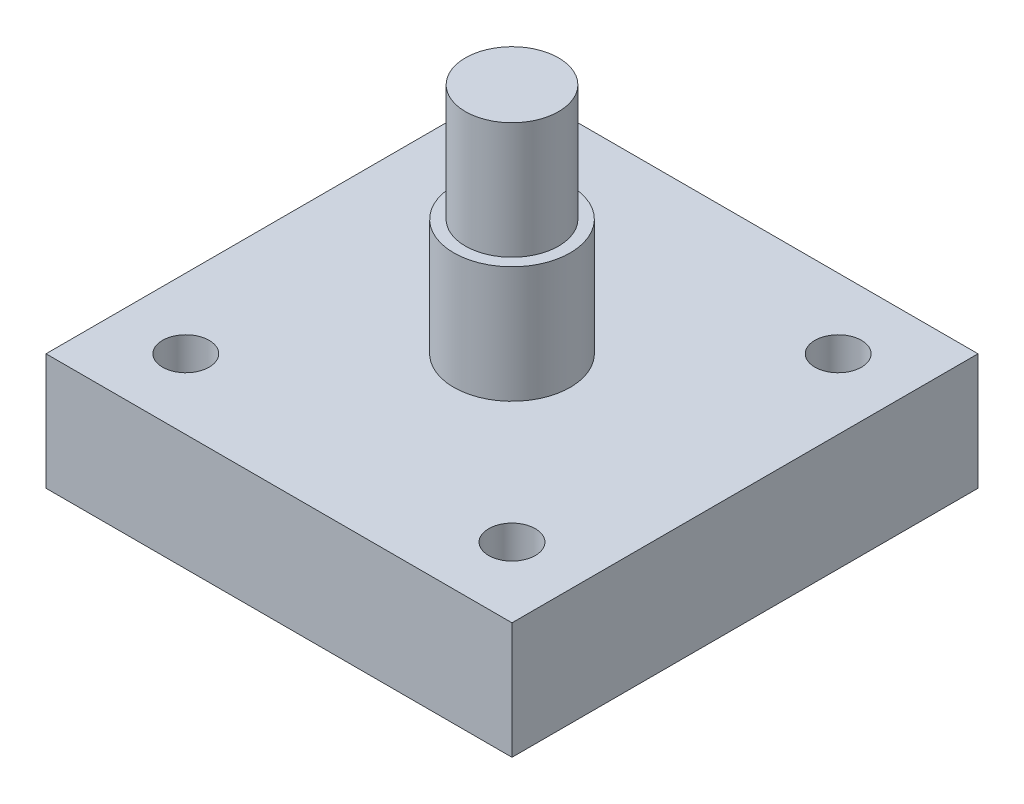
ISO-10303-21;
HEADER;
FILE_DESCRIPTION(('STEP AP214'),'2;1');
FILE_NAME('part.step','',(''),(''),'','','');
FILE_SCHEMA(('AUTOMOTIVE_DESIGN { 1 0 10303 214 1 1 1 1 }'));
ENDSEC;
DATA;
#1=APPLICATION_CONTEXT('core data for automotive mechanical design processes');
#2=APPLICATION_PROTOCOL_DEFINITION('international standard','automotive_design',2000,#1);
#3=PRODUCT_CONTEXT('',#1,'mechanical');
#4=PRODUCT('Part','Part','',(#3));
#5=PRODUCT_RELATED_PRODUCT_CATEGORY('part','',(#4));
#6=PRODUCT_DEFINITION_FORMATION('','',#4);
#7=PRODUCT_DEFINITION_CONTEXT('part definition',#1,'design');
#8=PRODUCT_DEFINITION('design','',#6,#7);
#9=PRODUCT_DEFINITION_SHAPE('','',#8);
#10=(LENGTH_UNIT() NAMED_UNIT(*) SI_UNIT(.MILLI.,.METRE.));
#11=(NAMED_UNIT(*) PLANE_ANGLE_UNIT() SI_UNIT($,.RADIAN.));
#12=(NAMED_UNIT(*) SI_UNIT($,.STERADIAN.) SOLID_ANGLE_UNIT());
#13=UNCERTAINTY_MEASURE_WITH_UNIT(LENGTH_MEASURE(1.E-05),#10,'distance_accuracy_value','');
#14=(GEOMETRIC_REPRESENTATION_CONTEXT(3) GLOBAL_UNCERTAINTY_ASSIGNED_CONTEXT((#13)) GLOBAL_UNIT_ASSIGNED_CONTEXT((#10,
#11,#12)) REPRESENTATION_CONTEXT('',''));
#15=CARTESIAN_POINT('',(0.,0.,0.));
#16=DIRECTION('',(0.,0.,1.));
#17=DIRECTION('',(1.,0.,0.));
#18=AXIS2_PLACEMENT_3D('',#15,#16,#17);
#19=CARTESIAN_POINT('',(0.,12.5,10.));
#20=DIRECTION('',(0.,-1.,0.));
#21=DIRECTION('',(0.,0.,-1.));
#22=AXIS2_PLACEMENT_3D('',#19,#20,#21);
#23=CYLINDRICAL_SURFACE('',#22,2.5);
#24=CARTESIAN_POINT('',(0.,2.5,10.));
#25=DIRECTION('',(0.,1.,0.));
#26=DIRECTION('',(0.,0.,1.));
#27=AXIS2_PLACEMENT_3D('',#24,#25,#26);
#28=CIRCLE('',#27,2.5);
#29=CARTESIAN_POINT('',(0.,2.5,12.5));
#30=VERTEX_POINT('',#29);
#31=EDGE_CURVE('E11',#30,#30,#28,.T.);
#32=ORIENTED_EDGE('',*,*,#31,.T.);
#33=EDGE_LOOP('',(#32));
#34=FACE_BOUND('',#33,.T.);
#35=CARTESIAN_POINT('',(0.,7.5,10.));
#36=DIRECTION('',(0.,1.,0.));
#37=DIRECTION('',(0.,0.,1.));
#38=AXIS2_PLACEMENT_3D('',#35,#36,#37);
#39=CIRCLE('',#38,2.5);
#40=CARTESIAN_POINT('',(0.,7.5,12.5));
#41=VERTEX_POINT('',#40);
#42=EDGE_CURVE('E140',#41,#41,#39,.T.);
#43=ORIENTED_EDGE('',*,*,#42,.F.);
#44=EDGE_LOOP('',(#43));
#45=FACE_BOUND('',#44,.T.);
#46=ADVANCED_FACE('F38',(#34,#45),#23,.T.);
#47=CARTESIAN_POINT('',(10.,2.5,20.));
#48=DIRECTION('',(-1.,0.,0.));
#49=DIRECTION('',(0.,0.,1.));
#50=AXIS2_PLACEMENT_3D('',#47,#48,#49);
#51=PLANE('',#50);
#52=DIRECTION('',(0.,1.,0.));
#53=VECTOR('',#52,1.);
#54=CARTESIAN_POINT('',(10.,2.5,0.));
#55=LINE('',#54,#53);
#56=CARTESIAN_POINT('',(10.,-2.5,0.));
#57=VERTEX_POINT('',#56);
#58=CARTESIAN_POINT('',(10.,2.5,0.));
#59=VERTEX_POINT('',#58);
#60=EDGE_CURVE('E105',#57,#59,#55,.T.);
#61=ORIENTED_EDGE('',*,*,#60,.T.);
#62=DIRECTION('',(0.,0.,-1.));
#63=VECTOR('',#62,1.);
#64=CARTESIAN_POINT('',(10.,2.5,20.));
#65=LINE('',#64,#63);
#66=CARTESIAN_POINT('',(10.,2.5,20.));
#67=VERTEX_POINT('',#66);
#68=EDGE_CURVE('E42',#67,#59,#65,.T.);
#69=ORIENTED_EDGE('',*,*,#68,.F.);
#70=DIRECTION('',(0.,1.,0.));
#71=VECTOR('',#70,1.);
#72=CARTESIAN_POINT('',(10.,2.5,20.));
#73=LINE('',#72,#71);
#74=CARTESIAN_POINT('',(10.,-2.5,20.));
#75=VERTEX_POINT('',#74);
#76=EDGE_CURVE('E92',#75,#67,#73,.T.);
#77=ORIENTED_EDGE('',*,*,#76,.F.);
#78=DIRECTION('',(0.,0.,-1.));
#79=VECTOR('',#78,1.);
#80=CARTESIAN_POINT('',(10.,-2.5,20.));
#81=LINE('',#80,#79);
#82=EDGE_CURVE('E101',#75,#57,#81,.T.);
#83=ORIENTED_EDGE('',*,*,#82,.T.);
#84=EDGE_LOOP('',(#61,#69,#77,#83));
#85=FACE_BOUND('',#84,.T.);
#86=ADVANCED_FACE('F40',(#85),#51,.F.);
#87=CARTESIAN_POINT('',(-10.,2.5,20.));
#88=DIRECTION('',(0.,-1.,0.));
#89=DIRECTION('',(0.,0.,-1.));
#90=AXIS2_PLACEMENT_3D('',#87,#88,#89);
#91=PLANE('',#90);
#92=CARTESIAN_POINT('',(7.,2.5,3.));
#93=DIRECTION('',(0.,1.,0.));
#94=DIRECTION('',(0.,0.,1.));
#95=AXIS2_PLACEMENT_3D('',#92,#93,#94);
#96=CIRCLE('',#95,1.);
#97=CARTESIAN_POINT('',(7.,2.5,4.));
#98=VERTEX_POINT('',#97);
#99=EDGE_CURVE('E132',#98,#98,#96,.T.);
#100=ORIENTED_EDGE('',*,*,#99,.F.);
#101=EDGE_LOOP('',(#100));
#102=FACE_BOUND('',#101,.T.);
#103=CARTESIAN_POINT('',(-7.,2.5,17.));
#104=DIRECTION('',(0.,1.,0.));
#105=DIRECTION('',(0.,0.,1.));
#106=AXIS2_PLACEMENT_3D('',#103,#104,#105);
#107=CIRCLE('',#106,1.);
#108=CARTESIAN_POINT('',(-7.,2.5,18.));
#109=VERTEX_POINT('',#108);
#110=EDGE_CURVE('E125',#109,#109,#107,.T.);
#111=ORIENTED_EDGE('',*,*,#110,.F.);
#112=EDGE_LOOP('',(#111));
#113=FACE_BOUND('',#112,.T.);
#114=CARTESIAN_POINT('',(7.,2.5,17.));
#115=DIRECTION('',(0.,1.,0.));
#116=DIRECTION('',(0.,0.,1.));
#117=AXIS2_PLACEMENT_3D('',#114,#115,#116);
#118=CIRCLE('',#117,1.);
#119=CARTESIAN_POINT('',(7.,2.5,18.));
#120=VERTEX_POINT('',#119);
#121=EDGE_CURVE('E137',#120,#120,#118,.T.);
#122=ORIENTED_EDGE('',*,*,#121,.F.);
#123=EDGE_LOOP('',(#122));
#124=FACE_BOUND('',#123,.T.);
#125=CARTESIAN_POINT('',(-7.,2.5,3.));
#126=DIRECTION('',(0.,1.,0.));
#127=DIRECTION('',(0.,0.,1.));
#128=AXIS2_PLACEMENT_3D('',#125,#126,#127);
#129=CIRCLE('',#128,1.);
#130=CARTESIAN_POINT('',(-7.,2.5,4.));
#131=VERTEX_POINT('',#130);
#132=EDGE_CURVE('E119',#131,#131,#129,.T.);
#133=ORIENTED_EDGE('',*,*,#132,.F.);
#134=EDGE_LOOP('',(#133));
#135=FACE_BOUND('',#134,.T.);
#136=ORIENTED_EDGE('',*,*,#31,.F.);
#137=EDGE_LOOP('',(#136));
#138=FACE_BOUND('',#137,.T.);
#139=DIRECTION('',(-1.,0.,0.));
#140=VECTOR('',#139,1.);
#141=CARTESIAN_POINT('',(-10.,2.5,0.));
#142=LINE('',#141,#140);
#143=CARTESIAN_POINT('',(-10.,2.5,0.));
#144=VERTEX_POINT('',#143);
#145=EDGE_CURVE('E97',#59,#144,#142,.T.);
#146=ORIENTED_EDGE('',*,*,#145,.T.);
#147=DIRECTION('',(0.,0.,-1.));
#148=VECTOR('',#147,1.);
#149=CARTESIAN_POINT('',(-10.,2.5,20.));
#150=LINE('',#149,#148);
#151=CARTESIAN_POINT('',(-10.,2.5,20.));
#152=VERTEX_POINT('',#151);
#153=EDGE_CURVE('E95',#152,#144,#150,.T.);
#154=ORIENTED_EDGE('',*,*,#153,.F.);
#155=DIRECTION('',(-1.,0.,0.));
#156=VECTOR('',#155,1.);
#157=CARTESIAN_POINT('',(-10.,2.5,20.));
#158=LINE('',#157,#156);
#159=EDGE_CURVE('E87',#67,#152,#158,.T.);
#160=ORIENTED_EDGE('',*,*,#159,.F.);
#161=ORIENTED_EDGE('',*,*,#68,.T.);
#162=EDGE_LOOP('',(#146,#154,#160,#161));
#163=FACE_BOUND('',#162,.T.);
#164=ADVANCED_FACE('F96',(#102,#113,#124,#135,#138,#163),#91,.F.);
#165=CARTESIAN_POINT('',(-10.,2.5,20.));
#166=DIRECTION('',(1.,0.,0.));
#167=DIRECTION('',(0.,0.,-1.));
#168=AXIS2_PLACEMENT_3D('',#165,#166,#167);
#169=PLANE('',#168);
#170=DIRECTION('',(0.,-1.,0.));
#171=VECTOR('',#170,1.);
#172=CARTESIAN_POINT('',(-10.,2.5,0.));
#173=LINE('',#172,#171);
#174=CARTESIAN_POINT('',(-10.,-2.5,0.));
#175=VERTEX_POINT('',#174);
#176=EDGE_CURVE('E73',#144,#175,#173,.T.);
#177=ORIENTED_EDGE('',*,*,#176,.T.);
#178=DIRECTION('',(0.,0.,-1.));
#179=VECTOR('',#178,1.);
#180=CARTESIAN_POINT('',(-10.,-2.5,20.));
#181=LINE('',#180,#179);
#182=CARTESIAN_POINT('',(-10.,-2.5,20.));
#183=VERTEX_POINT('',#182);
#184=EDGE_CURVE('E98',#183,#175,#181,.T.);
#185=ORIENTED_EDGE('',*,*,#184,.F.);
#186=DIRECTION('',(0.,-1.,0.));
#187=VECTOR('',#186,1.);
#188=CARTESIAN_POINT('',(-10.,2.5,20.));
#189=LINE('',#188,#187);
#190=EDGE_CURVE('E90',#152,#183,#189,.T.);
#191=ORIENTED_EDGE('',*,*,#190,.F.);
#192=ORIENTED_EDGE('',*,*,#153,.T.);
#193=EDGE_LOOP('',(#177,#185,#191,#192));
#194=FACE_BOUND('',#193,.T.);
#195=ADVANCED_FACE('F99',(#194),#169,.F.);
#196=CARTESIAN_POINT('',(-10.,-2.5,20.));
#197=DIRECTION('',(0.,1.,0.));
#198=DIRECTION('',(0.,0.,1.));
#199=AXIS2_PLACEMENT_3D('',#196,#197,#198);
#200=PLANE('',#199);
#201=CARTESIAN_POINT('',(7.,-2.5,3.));
#202=DIRECTION('',(0.,1.,0.));
#203=DIRECTION('',(0.,0.,1.));
#204=AXIS2_PLACEMENT_3D('',#201,#202,#203);
#205=CIRCLE('',#204,1.);
#206=CARTESIAN_POINT('',(7.,-2.5,4.));
#207=VERTEX_POINT('',#206);
#208=EDGE_CURVE('E122',#207,#207,#205,.T.);
#209=ORIENTED_EDGE('',*,*,#208,.T.);
#210=EDGE_LOOP('',(#209));
#211=FACE_BOUND('',#210,.T.);
#212=CARTESIAN_POINT('',(-7.,-2.5,17.));
#213=DIRECTION('',(0.,1.,0.));
#214=DIRECTION('',(0.,0.,1.));
#215=AXIS2_PLACEMENT_3D('',#212,#213,#214);
#216=CIRCLE('',#215,1.);
#217=CARTESIAN_POINT('',(-7.,-2.5,18.));
#218=VERTEX_POINT('',#217);
#219=EDGE_CURVE('E128',#218,#218,#216,.T.);
#220=ORIENTED_EDGE('',*,*,#219,.T.);
#221=EDGE_LOOP('',(#220));
#222=FACE_BOUND('',#221,.T.);
#223=CARTESIAN_POINT('',(7.,-2.5,17.));
#224=DIRECTION('',(0.,1.,0.));
#225=DIRECTION('',(0.,0.,1.));
#226=AXIS2_PLACEMENT_3D('',#223,#224,#225);
#227=CIRCLE('',#226,1.);
#228=CARTESIAN_POINT('',(7.,-2.5,18.));
#229=VERTEX_POINT('',#228);
#230=EDGE_CURVE('E129',#229,#229,#227,.T.);
#231=ORIENTED_EDGE('',*,*,#230,.T.);
#232=EDGE_LOOP('',(#231));
#233=FACE_BOUND('',#232,.T.);
#234=CARTESIAN_POINT('',(-7.,-2.5,3.));
#235=DIRECTION('',(0.,1.,0.));
#236=DIRECTION('',(0.,0.,1.));
#237=AXIS2_PLACEMENT_3D('',#234,#235,#236);
#238=CIRCLE('',#237,1.);
#239=CARTESIAN_POINT('',(-7.,-2.5,4.));
#240=VERTEX_POINT('',#239);
#241=EDGE_CURVE('E108',#240,#240,#238,.T.);
#242=ORIENTED_EDGE('',*,*,#241,.T.);
#243=EDGE_LOOP('',(#242));
#244=FACE_BOUND('',#243,.T.);
#245=DIRECTION('',(1.,0.,0.));
#246=VECTOR('',#245,1.);
#247=CARTESIAN_POINT('',(-10.,-2.5,0.));
#248=LINE('',#247,#246);
#249=EDGE_CURVE('E79',#175,#57,#248,.T.);
#250=ORIENTED_EDGE('',*,*,#249,.T.);
#251=ORIENTED_EDGE('',*,*,#82,.F.);
#252=DIRECTION('',(1.,0.,0.));
#253=VECTOR('',#252,1.);
#254=CARTESIAN_POINT('',(-10.,-2.5,20.));
#255=LINE('',#254,#253);
#256=EDGE_CURVE('E56',#183,#75,#255,.T.);
#257=ORIENTED_EDGE('',*,*,#256,.F.);
#258=ORIENTED_EDGE('',*,*,#184,.T.);
#259=EDGE_LOOP('',(#250,#251,#257,#258));
#260=FACE_BOUND('',#259,.T.);
#261=ADVANCED_FACE('F113',(#211,#222,#233,#244,#260),#200,.F.);
#262=CARTESIAN_POINT('',(0.,0.,20.));
#263=DIRECTION('',(0.,0.,1.));
#264=DIRECTION('',(1.,0.,0.));
#265=AXIS2_PLACEMENT_3D('',#262,#263,#264);
#266=PLANE('',#265);
#267=ORIENTED_EDGE('',*,*,#76,.T.);
#268=ORIENTED_EDGE('',*,*,#159,.T.);
#269=ORIENTED_EDGE('',*,*,#190,.T.);
#270=ORIENTED_EDGE('',*,*,#256,.T.);
#271=EDGE_LOOP('',(#267,#268,#269,#270));
#272=FACE_BOUND('',#271,.T.);
#273=ADVANCED_FACE('F88',(#272),#266,.T.);
#274=CARTESIAN_POINT('',(0.,0.,0.));
#275=DIRECTION('',(0.,0.,1.));
#276=DIRECTION('',(1.,0.,0.));
#277=AXIS2_PLACEMENT_3D('',#274,#275,#276);
#278=PLANE('',#277);
#279=ORIENTED_EDGE('',*,*,#60,.F.);
#280=ORIENTED_EDGE('',*,*,#249,.F.);
#281=ORIENTED_EDGE('',*,*,#176,.F.);
#282=ORIENTED_EDGE('',*,*,#145,.F.);
#283=EDGE_LOOP('',(#279,#280,#281,#282));
#284=FACE_BOUND('',#283,.T.);
#285=ADVANCED_FACE('F116',(#284),#278,.F.);
#286=CARTESIAN_POINT('',(-7.,-2.5,3.));
#287=DIRECTION('',(0.,1.,0.));
#288=DIRECTION('',(0.,0.,1.));
#289=AXIS2_PLACEMENT_3D('',#286,#287,#288);
#290=CYLINDRICAL_SURFACE('',#289,1.);
#291=ORIENTED_EDGE('',*,*,#241,.F.);
#292=EDGE_LOOP('',(#291));
#293=FACE_BOUND('',#292,.T.);
#294=ORIENTED_EDGE('',*,*,#132,.T.);
#295=EDGE_LOOP('',(#294));
#296=FACE_BOUND('',#295,.T.);
#297=ADVANCED_FACE('F176',(#293,#296),#290,.F.);
#298=CARTESIAN_POINT('',(7.,-2.5,17.));
#299=DIRECTION('',(0.,1.,0.));
#300=DIRECTION('',(0.,0.,1.));
#301=AXIS2_PLACEMENT_3D('',#298,#299,#300);
#302=CYLINDRICAL_SURFACE('',#301,1.);
#303=ORIENTED_EDGE('',*,*,#230,.F.);
#304=EDGE_LOOP('',(#303));
#305=FACE_BOUND('',#304,.T.);
#306=ORIENTED_EDGE('',*,*,#121,.T.);
#307=EDGE_LOOP('',(#306));
#308=FACE_BOUND('',#307,.T.);
#309=ADVANCED_FACE('F196',(#305,#308),#302,.F.);
#310=CARTESIAN_POINT('',(-7.,-2.5,17.));
#311=DIRECTION('',(0.,1.,0.));
#312=DIRECTION('',(0.,0.,1.));
#313=AXIS2_PLACEMENT_3D('',#310,#311,#312);
#314=CYLINDRICAL_SURFACE('',#313,1.);
#315=ORIENTED_EDGE('',*,*,#219,.F.);
#316=EDGE_LOOP('',(#315));
#317=FACE_BOUND('',#316,.T.);
#318=ORIENTED_EDGE('',*,*,#110,.T.);
#319=EDGE_LOOP('',(#318));
#320=FACE_BOUND('',#319,.T.);
#321=ADVANCED_FACE('F201',(#317,#320),#314,.F.);
#322=CARTESIAN_POINT('',(7.,-2.5,3.));
#323=DIRECTION('',(0.,1.,0.));
#324=DIRECTION('',(0.,0.,1.));
#325=AXIS2_PLACEMENT_3D('',#322,#323,#324);
#326=CYLINDRICAL_SURFACE('',#325,1.);
#327=ORIENTED_EDGE('',*,*,#208,.F.);
#328=EDGE_LOOP('',(#327));
#329=FACE_BOUND('',#328,.T.);
#330=ORIENTED_EDGE('',*,*,#99,.T.);
#331=EDGE_LOOP('',(#330));
#332=FACE_BOUND('',#331,.T.);
#333=ADVANCED_FACE('F158',(#329,#332),#326,.F.);
#334=CARTESIAN_POINT('',(0.,7.5,10.));
#335=DIRECTION('',(0.,1.,0.));
#336=DIRECTION('',(0.,0.,1.));
#337=AXIS2_PLACEMENT_3D('',#334,#335,#336);
#338=PLANE('',#337);
#339=CARTESIAN_POINT('',(0.,7.5,10.));
#340=DIRECTION('',(0.,1.,0.));
#341=DIRECTION('',(0.,0.,1.));
#342=AXIS2_PLACEMENT_3D('',#339,#340,#341);
#343=CIRCLE('',#342,2.);
#344=CARTESIAN_POINT('',(0.,7.5,12.));
#345=VERTEX_POINT('',#344);
#346=EDGE_CURVE('E145',#345,#345,#343,.T.);
#347=ORIENTED_EDGE('',*,*,#346,.F.);
#348=EDGE_LOOP('',(#347));
#349=FACE_BOUND('',#348,.T.);
#350=ORIENTED_EDGE('',*,*,#42,.T.);
#351=EDGE_LOOP('',(#350));
#352=FACE_BOUND('',#351,.T.);
#353=ADVANCED_FACE('F155',(#349,#352),#338,.T.);
#354=CARTESIAN_POINT('',(0.,7.5,10.));
#355=DIRECTION('',(0.,1.,0.));
#356=DIRECTION('',(0.,0.,1.));
#357=AXIS2_PLACEMENT_3D('',#354,#355,#356);
#358=CYLINDRICAL_SURFACE('',#357,2.);
#359=ORIENTED_EDGE('',*,*,#346,.T.);
#360=EDGE_LOOP('',(#359));
#361=FACE_BOUND('',#360,.T.);
#362=CARTESIAN_POINT('',(0.,12.5,10.));
#363=DIRECTION('',(0.,1.,0.));
#364=DIRECTION('',(0.,0.,1.));
#365=AXIS2_PLACEMENT_3D('',#362,#363,#364);
#366=CIRCLE('',#365,2.);
#367=CARTESIAN_POINT('',(0.,12.5,12.));
#368=VERTEX_POINT('',#367);
#369=EDGE_CURVE('E146',#368,#368,#366,.T.);
#370=ORIENTED_EDGE('',*,*,#369,.F.);
#371=EDGE_LOOP('',(#370));
#372=FACE_BOUND('',#371,.T.);
#373=ADVANCED_FACE('F152',(#361,#372),#358,.T.);
#374=CARTESIAN_POINT('',(0.,12.5,10.));
#375=DIRECTION('',(0.,1.,0.));
#376=DIRECTION('',(0.,0.,1.));
#377=AXIS2_PLACEMENT_3D('',#374,#375,#376);
#378=PLANE('',#377);
#379=ORIENTED_EDGE('',*,*,#369,.T.);
#380=EDGE_LOOP('',(#379));
#381=FACE_BOUND('',#380,.T.);
#382=ADVANCED_FACE('F170',(#381),#378,.T.);
#383=CLOSED_SHELL('',(#46,#86,#164,#195,#261,#273,#285,#297,#309,#321,#333,#353,#373,#382));
#384=MANIFOLD_SOLID_BREP('B2',#383);
#385=ADVANCED_BREP_SHAPE_REPRESENTATION('',(#18,#384),#14);
#386=SHAPE_DEFINITION_REPRESENTATION(#9,#385);
ENDSEC;
END-ISO-10303-21;
